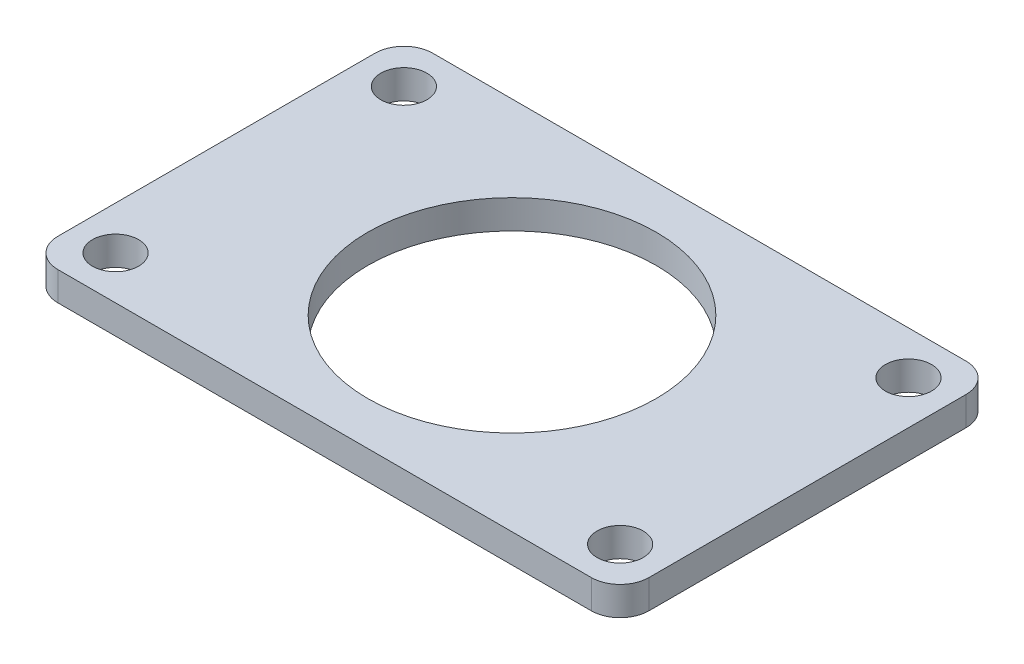
ISO-10303-21;
HEADER;
FILE_DESCRIPTION(('STEP AP214'),'2;1');
FILE_NAME('part.step','',(''),(''),'','','');
FILE_SCHEMA(('AUTOMOTIVE_DESIGN { 1 0 10303 214 1 1 1 1 }'));
ENDSEC;
DATA;
#1=APPLICATION_CONTEXT('core data for automotive mechanical design processes');
#2=APPLICATION_PROTOCOL_DEFINITION('international standard','automotive_design',2000,#1);
#3=PRODUCT_CONTEXT('',#1,'mechanical');
#4=PRODUCT('Part','Part','',(#3));
#5=PRODUCT_RELATED_PRODUCT_CATEGORY('part','',(#4));
#6=PRODUCT_DEFINITION_FORMATION('','',#4);
#7=PRODUCT_DEFINITION_CONTEXT('part definition',#1,'design');
#8=PRODUCT_DEFINITION('design','',#6,#7);
#9=PRODUCT_DEFINITION_SHAPE('','',#8);
#10=(LENGTH_UNIT() NAMED_UNIT(*) SI_UNIT(.MILLI.,.METRE.));
#11=(NAMED_UNIT(*) PLANE_ANGLE_UNIT() SI_UNIT($,.RADIAN.));
#12=(NAMED_UNIT(*) SI_UNIT($,.STERADIAN.) SOLID_ANGLE_UNIT());
#13=UNCERTAINTY_MEASURE_WITH_UNIT(LENGTH_MEASURE(1.E-05),#10,'distance_accuracy_value','');
#14=(GEOMETRIC_REPRESENTATION_CONTEXT(3) GLOBAL_UNCERTAINTY_ASSIGNED_CONTEXT((#13)) GLOBAL_UNIT_ASSIGNED_CONTEXT((#10,
#11,#12)) REPRESENTATION_CONTEXT('',''));
#15=CARTESIAN_POINT('',(0.,0.,0.));
#16=DIRECTION('',(0.,0.,1.));
#17=DIRECTION('',(1.,0.,0.));
#18=AXIS2_PLACEMENT_3D('',#15,#16,#17);
#19=CARTESIAN_POINT('',(0.,2.,0.));
#20=DIRECTION('',(0.,1.,0.));
#21=DIRECTION('',(0.,0.,1.));
#22=AXIS2_PLACEMENT_3D('',#19,#20,#21);
#23=PLANE('',#22);
#24=CARTESIAN_POINT('',(-17.5,2.,10.));
#25=DIRECTION('',(0.,1.,0.));
#26=DIRECTION('',(0.,0.,1.));
#27=AXIS2_PLACEMENT_3D('',#24,#25,#26);
#28=CIRCLE('',#27,1.6);
#29=CARTESIAN_POINT('',(-17.5,2.,11.6));
#30=VERTEX_POINT('',#29);
#31=EDGE_CURVE('E189',#30,#30,#28,.T.);
#32=ORIENTED_EDGE('',*,*,#31,.F.);
#33=EDGE_LOOP('',(#32));
#34=FACE_BOUND('',#33,.T.);
#35=CARTESIAN_POINT('',(17.5,2.,-10.));
#36=DIRECTION('',(0.,1.,0.));
#37=DIRECTION('',(0.,0.,1.));
#38=AXIS2_PLACEMENT_3D('',#35,#36,#37);
#39=CIRCLE('',#38,1.6);
#40=CARTESIAN_POINT('',(17.5,2.,-8.4));
#41=VERTEX_POINT('',#40);
#42=EDGE_CURVE('E178',#41,#41,#39,.T.);
#43=ORIENTED_EDGE('',*,*,#42,.F.);
#44=EDGE_LOOP('',(#43));
#45=FACE_BOUND('',#44,.T.);
#46=DIRECTION('',(0.,0.,-1.));
#47=VECTOR('',#46,1.);
#48=CARTESIAN_POINT('',(20.5,2.,-13.));
#49=LINE('',#48,#47);
#50=CARTESIAN_POINT('',(20.5,2.,11.));
#51=VERTEX_POINT('',#50);
#52=CARTESIAN_POINT('',(20.5,2.,-11.));
#53=VERTEX_POINT('',#52);
#54=EDGE_CURVE('E173',#51,#53,#49,.T.);
#55=ORIENTED_EDGE('',*,*,#54,.T.);
#56=CARTESIAN_POINT('',(18.5,2.,-11.));
#57=DIRECTION('',(0.,1.,0.));
#58=DIRECTION('',(0.,0.,1.));
#59=AXIS2_PLACEMENT_3D('',#56,#57,#58);
#60=CIRCLE('',#59,2.);
#61=CARTESIAN_POINT('',(18.5,2.,-13.));
#62=VERTEX_POINT('',#61);
#63=EDGE_CURVE('E150',#53,#62,#60,.T.);
#64=ORIENTED_EDGE('',*,*,#63,.T.);
#65=DIRECTION('',(-1.,0.,0.));
#66=VECTOR('',#65,1.);
#67=CARTESIAN_POINT('',(-20.5,2.,-13.));
#68=LINE('',#67,#66);
#69=CARTESIAN_POINT('',(-18.5,2.,-13.));
#70=VERTEX_POINT('',#69);
#71=EDGE_CURVE('E121',#62,#70,#68,.T.);
#72=ORIENTED_EDGE('',*,*,#71,.T.);
#73=CARTESIAN_POINT('',(-18.5,2.,-11.));
#74=DIRECTION('',(0.,1.,0.));
#75=DIRECTION('',(0.,0.,1.));
#76=AXIS2_PLACEMENT_3D('',#73,#74,#75);
#77=CIRCLE('',#76,2.);
#78=CARTESIAN_POINT('',(-20.5,2.,-11.));
#79=VERTEX_POINT('',#78);
#80=EDGE_CURVE('E145',#70,#79,#77,.T.);
#81=ORIENTED_EDGE('',*,*,#80,.T.);
#82=DIRECTION('',(0.,0.,1.));
#83=VECTOR('',#82,1.);
#84=CARTESIAN_POINT('',(-20.5,2.,-13.));
#85=LINE('',#84,#83);
#86=CARTESIAN_POINT('',(-20.5,2.,11.));
#87=VERTEX_POINT('',#86);
#88=EDGE_CURVE('E128',#79,#87,#85,.T.);
#89=ORIENTED_EDGE('',*,*,#88,.T.);
#90=CARTESIAN_POINT('',(-18.5,2.,11.));
#91=DIRECTION('',(0.,1.,0.));
#92=DIRECTION('',(0.,0.,1.));
#93=AXIS2_PLACEMENT_3D('',#90,#91,#92);
#94=CIRCLE('',#93,2.);
#95=CARTESIAN_POINT('',(-18.5,2.,13.));
#96=VERTEX_POINT('',#95);
#97=EDGE_CURVE('E57',#87,#96,#94,.T.);
#98=ORIENTED_EDGE('',*,*,#97,.T.);
#99=DIRECTION('',(1.,0.,0.));
#100=VECTOR('',#99,1.);
#101=CARTESIAN_POINT('',(-20.5,2.,13.));
#102=LINE('',#101,#100);
#103=CARTESIAN_POINT('',(18.5,2.,13.));
#104=VERTEX_POINT('',#103);
#105=EDGE_CURVE('E131',#96,#104,#102,.T.);
#106=ORIENTED_EDGE('',*,*,#105,.T.);
#107=CARTESIAN_POINT('',(18.5,2.,11.));
#108=DIRECTION('',(0.,1.,0.));
#109=DIRECTION('',(0.,0.,1.));
#110=AXIS2_PLACEMENT_3D('',#107,#108,#109);
#111=CIRCLE('',#110,2.);
#112=EDGE_CURVE('E148',#104,#51,#111,.T.);
#113=ORIENTED_EDGE('',*,*,#112,.T.);
#114=EDGE_LOOP('',(#55,#64,#72,#81,#89,#98,#106,#113));
#115=FACE_BOUND('',#114,.T.);
#116=CARTESIAN_POINT('',(-17.5,2.,-10.));
#117=DIRECTION('',(0.,1.,0.));
#118=DIRECTION('',(0.,0.,1.));
#119=AXIS2_PLACEMENT_3D('',#116,#117,#118);
#120=CIRCLE('',#119,1.6);
#121=CARTESIAN_POINT('',(-17.5,2.,-8.4));
#122=VERTEX_POINT('',#121);
#123=EDGE_CURVE('E166',#122,#122,#120,.T.);
#124=ORIENTED_EDGE('',*,*,#123,.F.);
#125=EDGE_LOOP('',(#124));
#126=FACE_BOUND('',#125,.T.);
#127=CARTESIAN_POINT('',(17.5,2.,10.));
#128=DIRECTION('',(0.,1.,0.));
#129=DIRECTION('',(0.,0.,1.));
#130=AXIS2_PLACEMENT_3D('',#127,#128,#129);
#131=CIRCLE('',#130,1.6);
#132=CARTESIAN_POINT('',(17.5,2.,11.6));
#133=VERTEX_POINT('',#132);
#134=EDGE_CURVE('E183',#133,#133,#131,.T.);
#135=ORIENTED_EDGE('',*,*,#134,.F.);
#136=EDGE_LOOP('',(#135));
#137=FACE_BOUND('',#136,.T.);
#138=CARTESIAN_POINT('',(0.,2.,0.));
#139=DIRECTION('',(0.,1.,0.));
#140=DIRECTION('',(0.,0.,1.));
#141=AXIS2_PLACEMENT_3D('',#138,#139,#140);
#142=CIRCLE('',#141,10.);
#143=CARTESIAN_POINT('',(0.,2.,10.));
#144=VERTEX_POINT('',#143);
#145=EDGE_CURVE('E195',#144,#144,#142,.T.);
#146=ORIENTED_EDGE('',*,*,#145,.F.);
#147=EDGE_LOOP('',(#146));
#148=FACE_BOUND('',#147,.T.);
#149=ADVANCED_FACE('F35',(#34,#45,#115,#126,#137,#148),#23,.T.);
#150=CARTESIAN_POINT('',(0.,0.,0.));
#151=DIRECTION('',(0.,1.,0.));
#152=DIRECTION('',(0.,0.,1.));
#153=AXIS2_PLACEMENT_3D('',#150,#151,#152);
#154=PLANE('',#153);
#155=DIRECTION('',(-1.,0.,0.));
#156=VECTOR('',#155,1.);
#157=CARTESIAN_POINT('',(-20.5,0.,-13.));
#158=LINE('',#157,#156);
#159=CARTESIAN_POINT('',(18.5,0.,-13.));
#160=VERTEX_POINT('',#159);
#161=CARTESIAN_POINT('',(-18.5,0.,-13.));
#162=VERTEX_POINT('',#161);
#163=EDGE_CURVE('E118',#160,#162,#158,.T.);
#164=ORIENTED_EDGE('',*,*,#163,.F.);
#165=CARTESIAN_POINT('',(18.5,0.,-11.));
#166=DIRECTION('',(0.,1.,0.));
#167=DIRECTION('',(0.,0.,1.));
#168=AXIS2_PLACEMENT_3D('',#165,#166,#167);
#169=CIRCLE('',#168,2.);
#170=CARTESIAN_POINT('',(20.5,0.,-11.));
#171=VERTEX_POINT('',#170);
#172=EDGE_CURVE('E101',#160,#171,#169,.F.);
#173=ORIENTED_EDGE('',*,*,#172,.T.);
#174=DIRECTION('',(0.,0.,-1.));
#175=VECTOR('',#174,1.);
#176=CARTESIAN_POINT('',(20.5,0.,-13.));
#177=LINE('',#176,#175);
#178=CARTESIAN_POINT('',(20.5,0.,11.));
#179=VERTEX_POINT('',#178);
#180=EDGE_CURVE('E129',#179,#171,#177,.T.);
#181=ORIENTED_EDGE('',*,*,#180,.F.);
#182=CARTESIAN_POINT('',(18.5,0.,11.));
#183=DIRECTION('',(0.,1.,0.));
#184=DIRECTION('',(0.,0.,1.));
#185=AXIS2_PLACEMENT_3D('',#182,#183,#184);
#186=CIRCLE('',#185,2.);
#187=CARTESIAN_POINT('',(18.5,0.,13.));
#188=VERTEX_POINT('',#187);
#189=EDGE_CURVE('E112',#179,#188,#186,.F.);
#190=ORIENTED_EDGE('',*,*,#189,.T.);
#191=DIRECTION('',(1.,0.,0.));
#192=VECTOR('',#191,1.);
#193=CARTESIAN_POINT('',(-20.5,0.,13.));
#194=LINE('',#193,#192);
#195=CARTESIAN_POINT('',(-18.5,0.,13.));
#196=VERTEX_POINT('',#195);
#197=EDGE_CURVE('E133',#196,#188,#194,.T.);
#198=ORIENTED_EDGE('',*,*,#197,.F.);
#199=CARTESIAN_POINT('',(-18.5,0.,11.));
#200=DIRECTION('',(0.,1.,0.));
#201=DIRECTION('',(0.,0.,1.));
#202=AXIS2_PLACEMENT_3D('',#199,#200,#201);
#203=CIRCLE('',#202,2.);
#204=CARTESIAN_POINT('',(-20.5,0.,11.));
#205=VERTEX_POINT('',#204);
#206=EDGE_CURVE('E139',#196,#205,#203,.F.);
#207=ORIENTED_EDGE('',*,*,#206,.T.);
#208=DIRECTION('',(0.,0.,1.));
#209=VECTOR('',#208,1.);
#210=CARTESIAN_POINT('',(-20.5,0.,-13.));
#211=LINE('',#210,#209);
#212=CARTESIAN_POINT('',(-20.5,0.,-11.));
#213=VERTEX_POINT('',#212);
#214=EDGE_CURVE('E161',#213,#205,#211,.T.);
#215=ORIENTED_EDGE('',*,*,#214,.F.);
#216=CARTESIAN_POINT('',(-18.5,0.,-11.));
#217=DIRECTION('',(0.,1.,0.));
#218=DIRECTION('',(0.,0.,1.));
#219=AXIS2_PLACEMENT_3D('',#216,#217,#218);
#220=CIRCLE('',#219,2.);
#221=EDGE_CURVE('E122',#213,#162,#220,.F.);
#222=ORIENTED_EDGE('',*,*,#221,.T.);
#223=EDGE_LOOP('',(#164,#173,#181,#190,#198,#207,#215,#222));
#224=FACE_BOUND('',#223,.T.);
#225=CARTESIAN_POINT('',(-17.5,0.,-10.));
#226=DIRECTION('',(0.,1.,0.));
#227=DIRECTION('',(0.,0.,1.));
#228=AXIS2_PLACEMENT_3D('',#225,#226,#227);
#229=CIRCLE('',#228,1.6);
#230=CARTESIAN_POINT('',(-17.5,0.,-8.4));
#231=VERTEX_POINT('',#230);
#232=EDGE_CURVE('E169',#231,#231,#229,.T.);
#233=ORIENTED_EDGE('',*,*,#232,.T.);
#234=EDGE_LOOP('',(#233));
#235=FACE_BOUND('',#234,.T.);
#236=CARTESIAN_POINT('',(17.5,0.,-10.));
#237=DIRECTION('',(0.,1.,0.));
#238=DIRECTION('',(0.,0.,1.));
#239=AXIS2_PLACEMENT_3D('',#236,#237,#238);
#240=CIRCLE('',#239,1.6);
#241=CARTESIAN_POINT('',(17.5,0.,-8.4));
#242=VERTEX_POINT('',#241);
#243=EDGE_CURVE('E180',#242,#242,#240,.T.);
#244=ORIENTED_EDGE('',*,*,#243,.T.);
#245=EDGE_LOOP('',(#244));
#246=FACE_BOUND('',#245,.T.);
#247=CARTESIAN_POINT('',(17.5,0.,10.));
#248=DIRECTION('',(0.,1.,0.));
#249=DIRECTION('',(0.,0.,1.));
#250=AXIS2_PLACEMENT_3D('',#247,#248,#249);
#251=CIRCLE('',#250,1.6);
#252=CARTESIAN_POINT('',(17.5,0.,11.6));
#253=VERTEX_POINT('',#252);
#254=EDGE_CURVE('E186',#253,#253,#251,.T.);
#255=ORIENTED_EDGE('',*,*,#254,.T.);
#256=EDGE_LOOP('',(#255));
#257=FACE_BOUND('',#256,.T.);
#258=CARTESIAN_POINT('',(-17.5,0.,10.));
#259=DIRECTION('',(0.,1.,0.));
#260=DIRECTION('',(0.,0.,1.));
#261=AXIS2_PLACEMENT_3D('',#258,#259,#260);
#262=CIRCLE('',#261,1.6);
#263=CARTESIAN_POINT('',(-17.5,0.,11.6));
#264=VERTEX_POINT('',#263);
#265=EDGE_CURVE('E192',#264,#264,#262,.T.);
#266=ORIENTED_EDGE('',*,*,#265,.T.);
#267=EDGE_LOOP('',(#266));
#268=FACE_BOUND('',#267,.T.);
#269=CARTESIAN_POINT('',(0.,0.,0.));
#270=DIRECTION('',(0.,1.,0.));
#271=DIRECTION('',(0.,0.,1.));
#272=AXIS2_PLACEMENT_3D('',#269,#270,#271);
#273=CIRCLE('',#272,10.);
#274=CARTESIAN_POINT('',(0.,0.,10.));
#275=VERTEX_POINT('',#274);
#276=EDGE_CURVE('E198',#275,#275,#273,.T.);
#277=ORIENTED_EDGE('',*,*,#276,.T.);
#278=EDGE_LOOP('',(#277));
#279=FACE_BOUND('',#278,.T.);
#280=ADVANCED_FACE('F125',(#224,#235,#246,#257,#268,#279),#154,.F.);
#281=CARTESIAN_POINT('',(-20.5,2.,-13.));
#282=DIRECTION('',(1.,0.,0.));
#283=DIRECTION('',(0.,0.,-1.));
#284=AXIS2_PLACEMENT_3D('',#281,#282,#283);
#285=PLANE('',#284);
#286=ORIENTED_EDGE('',*,*,#214,.T.);
#287=DIRECTION('',(0.,-1.,0.));
#288=VECTOR('',#287,1.);
#289=CARTESIAN_POINT('',(-20.5,2.,11.));
#290=LINE('',#289,#288);
#291=EDGE_CURVE('E11',#205,#87,#290,.F.);
#292=ORIENTED_EDGE('',*,*,#291,.T.);
#293=ORIENTED_EDGE('',*,*,#88,.F.);
#294=DIRECTION('',(0.,-1.,0.));
#295=VECTOR('',#294,1.);
#296=CARTESIAN_POINT('',(-20.5,2.,-11.));
#297=LINE('',#296,#295);
#298=EDGE_CURVE('E43',#79,#213,#297,.T.);
#299=ORIENTED_EDGE('',*,*,#298,.T.);
#300=EDGE_LOOP('',(#286,#292,#293,#299));
#301=FACE_BOUND('',#300,.T.);
#302=ADVANCED_FACE('F160',(#301),#285,.F.);
#303=CARTESIAN_POINT('',(-20.5,2.,13.));
#304=DIRECTION('',(0.,0.,-1.));
#305=DIRECTION('',(-1.,0.,0.));
#306=AXIS2_PLACEMENT_3D('',#303,#304,#305);
#307=PLANE('',#306);
#308=ORIENTED_EDGE('',*,*,#197,.T.);
#309=DIRECTION('',(0.,-1.,0.));
#310=VECTOR('',#309,1.);
#311=CARTESIAN_POINT('',(18.5,2.,13.));
#312=LINE('',#311,#310);
#313=EDGE_CURVE('E50',#188,#104,#312,.F.);
#314=ORIENTED_EDGE('',*,*,#313,.T.);
#315=ORIENTED_EDGE('',*,*,#105,.F.);
#316=DIRECTION('',(0.,-1.,0.));
#317=VECTOR('',#316,1.);
#318=CARTESIAN_POINT('',(-18.5,2.,13.));
#319=LINE('',#318,#317);
#320=EDGE_CURVE('E152',#96,#196,#319,.T.);
#321=ORIENTED_EDGE('',*,*,#320,.T.);
#322=EDGE_LOOP('',(#308,#314,#315,#321));
#323=FACE_BOUND('',#322,.T.);
#324=ADVANCED_FACE('F225',(#323),#307,.F.);
#325=CARTESIAN_POINT('',(20.5,2.,-13.));
#326=DIRECTION('',(-1.,0.,0.));
#327=DIRECTION('',(0.,0.,1.));
#328=AXIS2_PLACEMENT_3D('',#325,#326,#327);
#329=PLANE('',#328);
#330=ORIENTED_EDGE('',*,*,#180,.T.);
#331=DIRECTION('',(0.,-1.,0.));
#332=VECTOR('',#331,1.);
#333=CARTESIAN_POINT('',(20.5,2.,-11.));
#334=LINE('',#333,#332);
#335=EDGE_CURVE('E106',#171,#53,#334,.F.);
#336=ORIENTED_EDGE('',*,*,#335,.T.);
#337=ORIENTED_EDGE('',*,*,#54,.F.);
#338=DIRECTION('',(0.,-1.,0.));
#339=VECTOR('',#338,1.);
#340=CARTESIAN_POINT('',(20.5,2.,11.));
#341=LINE('',#340,#339);
#342=EDGE_CURVE('E111',#51,#179,#341,.T.);
#343=ORIENTED_EDGE('',*,*,#342,.T.);
#344=EDGE_LOOP('',(#330,#336,#337,#343));
#345=FACE_BOUND('',#344,.T.);
#346=ADVANCED_FACE('F222',(#345),#329,.F.);
#347=CARTESIAN_POINT('',(-20.5,2.,-13.));
#348=DIRECTION('',(0.,0.,1.));
#349=DIRECTION('',(1.,0.,0.));
#350=AXIS2_PLACEMENT_3D('',#347,#348,#349);
#351=PLANE('',#350);
#352=ORIENTED_EDGE('',*,*,#71,.F.);
#353=DIRECTION('',(0.,-1.,0.));
#354=VECTOR('',#353,1.);
#355=CARTESIAN_POINT('',(18.5,2.,-13.));
#356=LINE('',#355,#354);
#357=EDGE_CURVE('E105',#62,#160,#356,.T.);
#358=ORIENTED_EDGE('',*,*,#357,.T.);
#359=ORIENTED_EDGE('',*,*,#163,.T.);
#360=DIRECTION('',(0.,-1.,0.));
#361=VECTOR('',#360,1.);
#362=CARTESIAN_POINT('',(-18.5,2.,-13.));
#363=LINE('',#362,#361);
#364=EDGE_CURVE('E123',#162,#70,#363,.F.);
#365=ORIENTED_EDGE('',*,*,#364,.T.);
#366=EDGE_LOOP('',(#352,#358,#359,#365));
#367=FACE_BOUND('',#366,.T.);
#368=ADVANCED_FACE('F117',(#367),#351,.F.);
#369=CARTESIAN_POINT('',(-17.5,2.,-10.));
#370=DIRECTION('',(0.,-1.,0.));
#371=DIRECTION('',(0.,0.,-1.));
#372=AXIS2_PLACEMENT_3D('',#369,#370,#371);
#373=CYLINDRICAL_SURFACE('',#372,1.6);
#374=ORIENTED_EDGE('',*,*,#123,.T.);
#375=EDGE_LOOP('',(#374));
#376=FACE_BOUND('',#375,.T.);
#377=ORIENTED_EDGE('',*,*,#232,.F.);
#378=EDGE_LOOP('',(#377));
#379=FACE_BOUND('',#378,.T.);
#380=ADVANCED_FACE('F217',(#376,#379),#373,.F.);
#381=CARTESIAN_POINT('',(17.5,2.,-10.));
#382=DIRECTION('',(0.,-1.,0.));
#383=DIRECTION('',(0.,0.,-1.));
#384=AXIS2_PLACEMENT_3D('',#381,#382,#383);
#385=CYLINDRICAL_SURFACE('',#384,1.6);
#386=ORIENTED_EDGE('',*,*,#42,.T.);
#387=EDGE_LOOP('',(#386));
#388=FACE_BOUND('',#387,.T.);
#389=ORIENTED_EDGE('',*,*,#243,.F.);
#390=EDGE_LOOP('',(#389));
#391=FACE_BOUND('',#390,.T.);
#392=ADVANCED_FACE('F255',(#388,#391),#385,.F.);
#393=CARTESIAN_POINT('',(17.5,2.,10.));
#394=DIRECTION('',(0.,-1.,0.));
#395=DIRECTION('',(0.,0.,-1.));
#396=AXIS2_PLACEMENT_3D('',#393,#394,#395);
#397=CYLINDRICAL_SURFACE('',#396,1.6);
#398=ORIENTED_EDGE('',*,*,#134,.T.);
#399=EDGE_LOOP('',(#398));
#400=FACE_BOUND('',#399,.T.);
#401=ORIENTED_EDGE('',*,*,#254,.F.);
#402=EDGE_LOOP('',(#401));
#403=FACE_BOUND('',#402,.T.);
#404=ADVANCED_FACE('F251',(#400,#403),#397,.F.);
#405=CARTESIAN_POINT('',(-17.5,2.,10.));
#406=DIRECTION('',(0.,-1.,0.));
#407=DIRECTION('',(0.,0.,-1.));
#408=AXIS2_PLACEMENT_3D('',#405,#406,#407);
#409=CYLINDRICAL_SURFACE('',#408,1.6);
#410=ORIENTED_EDGE('',*,*,#31,.T.);
#411=EDGE_LOOP('',(#410));
#412=FACE_BOUND('',#411,.T.);
#413=ORIENTED_EDGE('',*,*,#265,.F.);
#414=EDGE_LOOP('',(#413));
#415=FACE_BOUND('',#414,.T.);
#416=ADVANCED_FACE('F254',(#412,#415),#409,.F.);
#417=CARTESIAN_POINT('',(0.,2.,0.));
#418=DIRECTION('',(0.,-1.,0.));
#419=DIRECTION('',(0.,0.,-1.));
#420=AXIS2_PLACEMENT_3D('',#417,#418,#419);
#421=CYLINDRICAL_SURFACE('',#420,10.);
#422=ORIENTED_EDGE('',*,*,#145,.T.);
#423=EDGE_LOOP('',(#422));
#424=FACE_BOUND('',#423,.T.);
#425=ORIENTED_EDGE('',*,*,#276,.F.);
#426=EDGE_LOOP('',(#425));
#427=FACE_BOUND('',#426,.T.);
#428=ADVANCED_FACE('F204',(#424,#427),#421,.F.);
#429=CARTESIAN_POINT('',(18.5,2.,-11.));
#430=DIRECTION('',(0.,-1.,0.));
#431=DIRECTION('',(0.,0.,-1.));
#432=AXIS2_PLACEMENT_3D('',#429,#430,#431);
#433=CYLINDRICAL_SURFACE('',#432,2.);
#434=ORIENTED_EDGE('',*,*,#63,.F.);
#435=ORIENTED_EDGE('',*,*,#335,.F.);
#436=ORIENTED_EDGE('',*,*,#172,.F.);
#437=ORIENTED_EDGE('',*,*,#357,.F.);
#438=EDGE_LOOP('',(#434,#435,#436,#437));
#439=FACE_BOUND('',#438,.T.);
#440=ADVANCED_FACE('F104',(#439),#433,.T.);
#441=CARTESIAN_POINT('',(18.5,2.,11.));
#442=DIRECTION('',(0.,-1.,0.));
#443=DIRECTION('',(0.,0.,-1.));
#444=AXIS2_PLACEMENT_3D('',#441,#442,#443);
#445=CYLINDRICAL_SURFACE('',#444,2.);
#446=ORIENTED_EDGE('',*,*,#112,.F.);
#447=ORIENTED_EDGE('',*,*,#313,.F.);
#448=ORIENTED_EDGE('',*,*,#189,.F.);
#449=ORIENTED_EDGE('',*,*,#342,.F.);
#450=EDGE_LOOP('',(#446,#447,#448,#449));
#451=FACE_BOUND('',#450,.T.);
#452=ADVANCED_FACE('F233',(#451),#445,.T.);
#453=CARTESIAN_POINT('',(-18.5,2.,11.));
#454=DIRECTION('',(0.,-1.,0.));
#455=DIRECTION('',(0.,0.,-1.));
#456=AXIS2_PLACEMENT_3D('',#453,#454,#455);
#457=CYLINDRICAL_SURFACE('',#456,2.);
#458=ORIENTED_EDGE('',*,*,#97,.F.);
#459=ORIENTED_EDGE('',*,*,#291,.F.);
#460=ORIENTED_EDGE('',*,*,#206,.F.);
#461=ORIENTED_EDGE('',*,*,#320,.F.);
#462=EDGE_LOOP('',(#458,#459,#460,#461));
#463=FACE_BOUND('',#462,.T.);
#464=ADVANCED_FACE('F235',(#463),#457,.T.);
#465=CARTESIAN_POINT('',(-18.5,2.,-11.));
#466=DIRECTION('',(0.,-1.,0.));
#467=DIRECTION('',(0.,0.,-1.));
#468=AXIS2_PLACEMENT_3D('',#465,#466,#467);
#469=CYLINDRICAL_SURFACE('',#468,2.);
#470=ORIENTED_EDGE('',*,*,#80,.F.);
#471=ORIENTED_EDGE('',*,*,#364,.F.);
#472=ORIENTED_EDGE('',*,*,#221,.F.);
#473=ORIENTED_EDGE('',*,*,#298,.F.);
#474=EDGE_LOOP('',(#470,#471,#472,#473));
#475=FACE_BOUND('',#474,.T.);
#476=ADVANCED_FACE('F37',(#475),#469,.T.);
#477=CLOSED_SHELL('',(#149,#280,#302,#324,#346,#368,#380,#392,#404,#416,#428,#440,#452,#464,#476));
#478=MANIFOLD_SOLID_BREP('B2',#477);
#479=ADVANCED_BREP_SHAPE_REPRESENTATION('',(#18,#478),#14);
#480=SHAPE_DEFINITION_REPRESENTATION(#9,#479);
ENDSEC;
END-ISO-10303-21;
